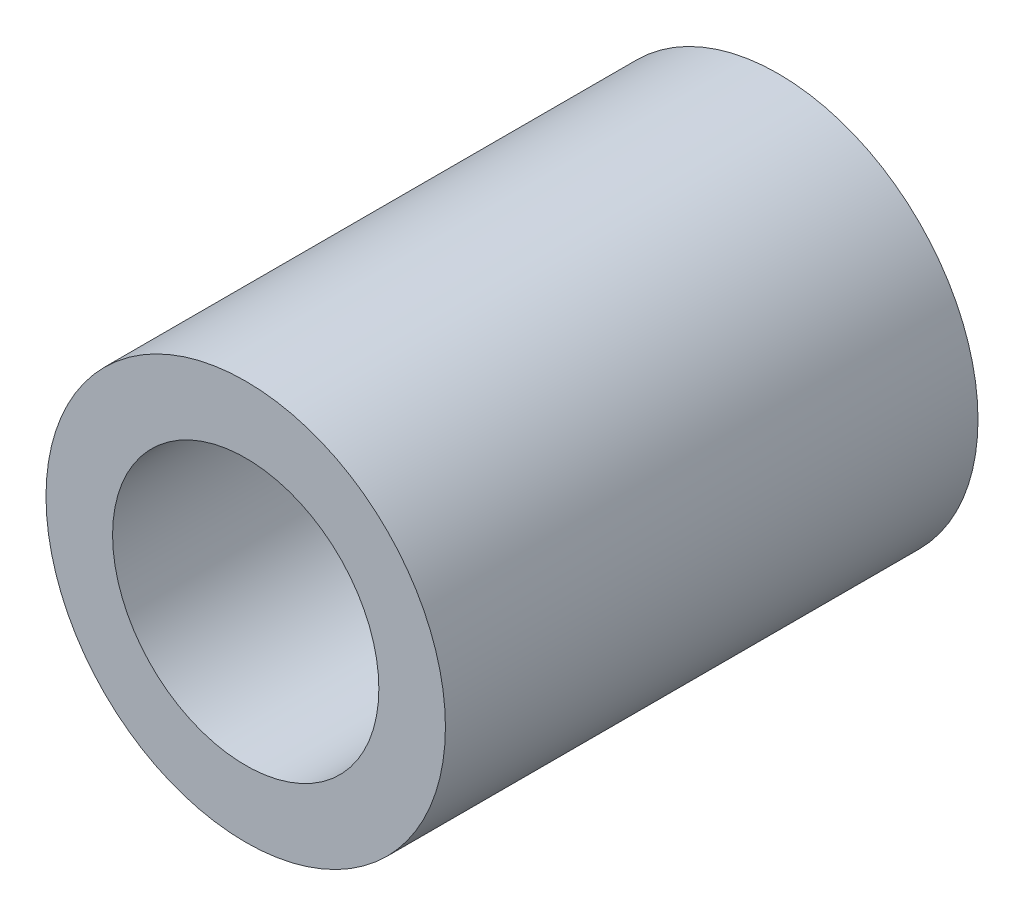
ISO-10303-21;
HEADER;
FILE_DESCRIPTION(('STEP AP214'),'2;1');
FILE_NAME('part.step','',(''),(''),'','','');
FILE_SCHEMA(('AUTOMOTIVE_DESIGN { 1 0 10303 214 1 1 1 1 }'));
ENDSEC;
DATA;
#1=APPLICATION_CONTEXT('core data for automotive mechanical design processes');
#2=APPLICATION_PROTOCOL_DEFINITION('international standard','automotive_design',2000,#1);
#3=PRODUCT_CONTEXT('',#1,'mechanical');
#4=PRODUCT('Part','Part','',(#3));
#5=PRODUCT_RELATED_PRODUCT_CATEGORY('part','',(#4));
#6=PRODUCT_DEFINITION_FORMATION('','',#4);
#7=PRODUCT_DEFINITION_CONTEXT('part definition',#1,'design');
#8=PRODUCT_DEFINITION('design','',#6,#7);
#9=PRODUCT_DEFINITION_SHAPE('','',#8);
#10=(LENGTH_UNIT() NAMED_UNIT(*) SI_UNIT(.MILLI.,.METRE.));
#11=(NAMED_UNIT(*) PLANE_ANGLE_UNIT() SI_UNIT($,.RADIAN.));
#12=(NAMED_UNIT(*) SI_UNIT($,.STERADIAN.) SOLID_ANGLE_UNIT());
#13=UNCERTAINTY_MEASURE_WITH_UNIT(LENGTH_MEASURE(1.E-05),#10,'distance_accuracy_value','');
#14=(GEOMETRIC_REPRESENTATION_CONTEXT(3) GLOBAL_UNCERTAINTY_ASSIGNED_CONTEXT((#13)) GLOBAL_UNIT_ASSIGNED_CONTEXT((#10,
#11,#12)) REPRESENTATION_CONTEXT('',''));
#15=CARTESIAN_POINT('',(0.,0.,0.));
#16=DIRECTION('',(0.,0.,1.));
#17=DIRECTION('',(1.,0.,0.));
#18=AXIS2_PLACEMENT_3D('',#15,#16,#17);
#19=CARTESIAN_POINT('',(0.,0.,32.));
#20=DIRECTION('',(0.,0.,1.));
#21=DIRECTION('',(1.,0.,0.));
#22=AXIS2_PLACEMENT_3D('',#19,#20,#21);
#23=PLANE('',#22);
#24=CARTESIAN_POINT('',(0.,0.,32.));
#25=DIRECTION('',(0.,0.,1.));
#26=DIRECTION('',(1.,0.,0.));
#27=AXIS2_PLACEMENT_3D('',#24,#25,#26);
#28=CIRCLE('',#27,12.);
#29=CARTESIAN_POINT('',(12.,0.,32.));
#30=VERTEX_POINT('',#29);
#31=EDGE_CURVE('E10',#30,#30,#28,.T.);
#32=ORIENTED_EDGE('',*,*,#31,.T.);
#33=EDGE_LOOP('',(#32));
#34=FACE_BOUND('',#33,.T.);
#35=CARTESIAN_POINT('',(0.,0.,32.));
#36=DIRECTION('',(0.,0.,1.));
#37=DIRECTION('',(1.,0.,0.));
#38=AXIS2_PLACEMENT_3D('',#35,#36,#37);
#39=CIRCLE('',#38,8.);
#40=CARTESIAN_POINT('',(8.,0.,32.));
#41=VERTEX_POINT('',#40);
#42=EDGE_CURVE('E42',#41,#41,#39,.T.);
#43=ORIENTED_EDGE('',*,*,#42,.F.);
#44=EDGE_LOOP('',(#43));
#45=FACE_BOUND('',#44,.T.);
#46=ADVANCED_FACE('F31',(#34,#45),#23,.T.);
#47=CARTESIAN_POINT('',(0.,0.,0.));
#48=DIRECTION('',(0.,0.,1.));
#49=DIRECTION('',(1.,0.,0.));
#50=AXIS2_PLACEMENT_3D('',#47,#48,#49);
#51=PLANE('',#50);
#52=CARTESIAN_POINT('',(0.,0.,0.));
#53=DIRECTION('',(0.,0.,1.));
#54=DIRECTION('',(1.,0.,0.));
#55=AXIS2_PLACEMENT_3D('',#52,#53,#54);
#56=CIRCLE('',#55,12.);
#57=CARTESIAN_POINT('',(12.,0.,0.));
#58=VERTEX_POINT('',#57);
#59=EDGE_CURVE('E38',#58,#58,#56,.T.);
#60=ORIENTED_EDGE('',*,*,#59,.F.);
#61=EDGE_LOOP('',(#60));
#62=FACE_BOUND('',#61,.T.);
#63=CARTESIAN_POINT('',(0.,0.,0.));
#64=DIRECTION('',(0.,0.,1.));
#65=DIRECTION('',(1.,0.,0.));
#66=AXIS2_PLACEMENT_3D('',#63,#64,#65);
#67=CIRCLE('',#66,8.);
#68=CARTESIAN_POINT('',(8.,0.,0.));
#69=VERTEX_POINT('',#68);
#70=EDGE_CURVE('E46',#69,#69,#67,.T.);
#71=ORIENTED_EDGE('',*,*,#70,.T.);
#72=EDGE_LOOP('',(#71));
#73=FACE_BOUND('',#72,.T.);
#74=ADVANCED_FACE('F52',(#62,#73),#51,.F.);
#75=CARTESIAN_POINT('',(0.,0.,32.));
#76=DIRECTION('',(0.,0.,-1.));
#77=DIRECTION('',(-1.,0.,0.));
#78=AXIS2_PLACEMENT_3D('',#75,#76,#77);
#79=CYLINDRICAL_SURFACE('',#78,12.);
#80=ORIENTED_EDGE('',*,*,#31,.F.);
#81=EDGE_LOOP('',(#80));
#82=FACE_BOUND('',#81,.T.);
#83=ORIENTED_EDGE('',*,*,#59,.T.);
#84=EDGE_LOOP('',(#83));
#85=FACE_BOUND('',#84,.T.);
#86=ADVANCED_FACE('F33',(#82,#85),#79,.T.);
#87=CARTESIAN_POINT('',(0.,0.,32.));
#88=DIRECTION('',(0.,0.,-1.));
#89=DIRECTION('',(-1.,0.,0.));
#90=AXIS2_PLACEMENT_3D('',#87,#88,#89);
#91=CYLINDRICAL_SURFACE('',#90,8.);
#92=ORIENTED_EDGE('',*,*,#42,.T.);
#93=EDGE_LOOP('',(#92));
#94=FACE_BOUND('',#93,.T.);
#95=ORIENTED_EDGE('',*,*,#70,.F.);
#96=EDGE_LOOP('',(#95));
#97=FACE_BOUND('',#96,.T.);
#98=ADVANCED_FACE('F54',(#94,#97),#91,.F.);
#99=CLOSED_SHELL('',(#46,#74,#86,#98));
#100=MANIFOLD_SOLID_BREP('B2',#99);
#101=ADVANCED_BREP_SHAPE_REPRESENTATION('',(#18,#100),#14);
#102=SHAPE_DEFINITION_REPRESENTATION(#9,#101);
ENDSEC;
END-ISO-10303-21;
